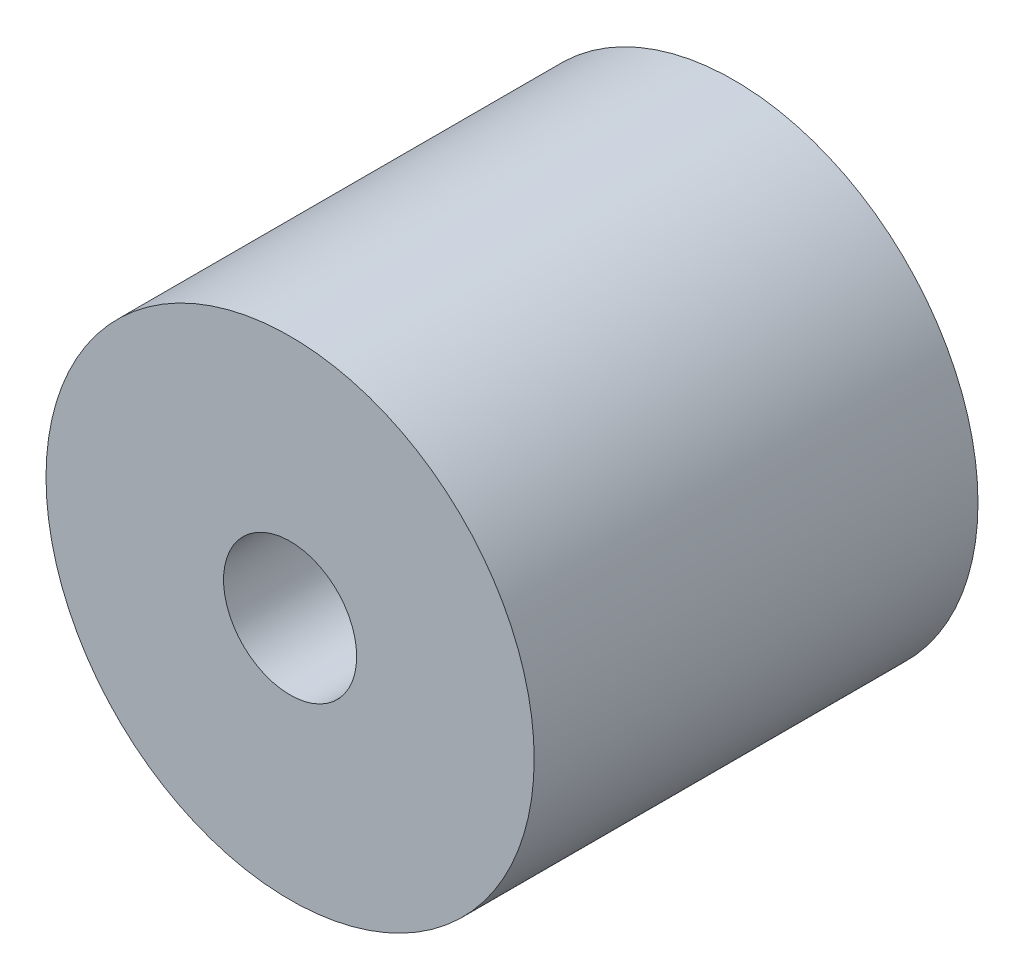
ISO-10303-21;
HEADER;
FILE_DESCRIPTION(('STEP AP214'),'2;1');
FILE_NAME('part.step','',(''),(''),'','','');
FILE_SCHEMA(('AUTOMOTIVE_DESIGN { 1 0 10303 214 1 1 1 1 }'));
ENDSEC;
DATA;
#1=APPLICATION_CONTEXT('core data for automotive mechanical design processes');
#2=APPLICATION_PROTOCOL_DEFINITION('international standard','automotive_design',2000,#1);
#3=PRODUCT_CONTEXT('',#1,'mechanical');
#4=PRODUCT('Part','Part','',(#3));
#5=PRODUCT_RELATED_PRODUCT_CATEGORY('part','',(#4));
#6=PRODUCT_DEFINITION_FORMATION('','',#4);
#7=PRODUCT_DEFINITION_CONTEXT('part definition',#1,'design');
#8=PRODUCT_DEFINITION('design','',#6,#7);
#9=PRODUCT_DEFINITION_SHAPE('','',#8);
#10=(LENGTH_UNIT() NAMED_UNIT(*) SI_UNIT(.MILLI.,.METRE.));
#11=(NAMED_UNIT(*) PLANE_ANGLE_UNIT() SI_UNIT($,.RADIAN.));
#12=(NAMED_UNIT(*) SI_UNIT($,.STERADIAN.) SOLID_ANGLE_UNIT());
#13=UNCERTAINTY_MEASURE_WITH_UNIT(LENGTH_MEASURE(1.E-05),#10,'distance_accuracy_value','');
#14=(GEOMETRIC_REPRESENTATION_CONTEXT(3) GLOBAL_UNCERTAINTY_ASSIGNED_CONTEXT((#13)) GLOBAL_UNIT_ASSIGNED_CONTEXT((#10,
#11,#12)) REPRESENTATION_CONTEXT('',''));
#15=CARTESIAN_POINT('',(0.,0.,0.));
#16=DIRECTION('',(0.,0.,1.));
#17=DIRECTION('',(1.,0.,0.));
#18=AXIS2_PLACEMENT_3D('',#15,#16,#17);
#19=CARTESIAN_POINT('',(0.,0.,10.));
#20=DIRECTION('',(0.,0.,1.));
#21=DIRECTION('',(1.,0.,0.));
#22=AXIS2_PLACEMENT_3D('',#19,#20,#21);
#23=PLANE('',#22);
#24=CARTESIAN_POINT('',(0.,0.,10.));
#25=DIRECTION('',(0.,0.,1.));
#26=DIRECTION('',(1.,0.,0.));
#27=AXIS2_PLACEMENT_3D('',#24,#25,#26);
#28=CIRCLE('',#27,5.5);
#29=CARTESIAN_POINT('',(5.5,0.,10.));
#30=VERTEX_POINT('',#29);
#31=EDGE_CURVE('E10',#30,#30,#28,.T.);
#32=ORIENTED_EDGE('',*,*,#31,.T.);
#33=EDGE_LOOP('',(#32));
#34=FACE_BOUND('',#33,.T.);
#35=CARTESIAN_POINT('',(0.,0.,10.));
#36=DIRECTION('',(0.,0.,1.));
#37=DIRECTION('',(1.,0.,0.));
#38=AXIS2_PLACEMENT_3D('',#35,#36,#37);
#39=CIRCLE('',#38,1.5);
#40=CARTESIAN_POINT('',(1.5,0.,10.));
#41=VERTEX_POINT('',#40);
#42=EDGE_CURVE('E40',#41,#41,#39,.T.);
#43=ORIENTED_EDGE('',*,*,#42,.F.);
#44=EDGE_LOOP('',(#43));
#45=FACE_BOUND('',#44,.T.);
#46=ADVANCED_FACE('F29',(#34,#45),#23,.T.);
#47=CARTESIAN_POINT('',(0.,0.,0.));
#48=DIRECTION('',(0.,0.,1.));
#49=DIRECTION('',(1.,0.,0.));
#50=AXIS2_PLACEMENT_3D('',#47,#48,#49);
#51=PLANE('',#50);
#52=CARTESIAN_POINT('',(0.,0.,0.));
#53=DIRECTION('',(0.,0.,1.));
#54=DIRECTION('',(1.,0.,0.));
#55=AXIS2_PLACEMENT_3D('',#52,#53,#54);
#56=CIRCLE('',#55,5.5);
#57=CARTESIAN_POINT('',(5.5,0.,0.));
#58=VERTEX_POINT('',#57);
#59=EDGE_CURVE('E33',#58,#58,#56,.T.);
#60=ORIENTED_EDGE('',*,*,#59,.F.);
#61=EDGE_LOOP('',(#60));
#62=FACE_BOUND('',#61,.T.);
#63=CARTESIAN_POINT('',(0.,0.,0.));
#64=DIRECTION('',(0.,0.,1.));
#65=DIRECTION('',(1.,0.,0.));
#66=AXIS2_PLACEMENT_3D('',#63,#64,#65);
#67=CIRCLE('',#66,1.5);
#68=CARTESIAN_POINT('',(1.5,0.,0.));
#69=VERTEX_POINT('',#68);
#70=EDGE_CURVE('E42',#69,#69,#67,.T.);
#71=ORIENTED_EDGE('',*,*,#70,.T.);
#72=EDGE_LOOP('',(#71));
#73=FACE_BOUND('',#72,.T.);
#74=ADVANCED_FACE('F52',(#62,#73),#51,.F.);
#75=CARTESIAN_POINT('',(0.,0.,10.));
#76=DIRECTION('',(0.,0.,-1.));
#77=DIRECTION('',(-1.,0.,0.));
#78=AXIS2_PLACEMENT_3D('',#75,#76,#77);
#79=CYLINDRICAL_SURFACE('',#78,5.5);
#80=ORIENTED_EDGE('',*,*,#31,.F.);
#81=EDGE_LOOP('',(#80));
#82=FACE_BOUND('',#81,.T.);
#83=ORIENTED_EDGE('',*,*,#59,.T.);
#84=EDGE_LOOP('',(#83));
#85=FACE_BOUND('',#84,.T.);
#86=ADVANCED_FACE('F31',(#82,#85),#79,.T.);
#87=CARTESIAN_POINT('',(0.,0.,10.));
#88=DIRECTION('',(0.,0.,-1.));
#89=DIRECTION('',(-1.,0.,0.));
#90=AXIS2_PLACEMENT_3D('',#87,#88,#89);
#91=CYLINDRICAL_SURFACE('',#90,1.5);
#92=ORIENTED_EDGE('',*,*,#42,.T.);
#93=EDGE_LOOP('',(#92));
#94=FACE_BOUND('',#93,.T.);
#95=ORIENTED_EDGE('',*,*,#70,.F.);
#96=EDGE_LOOP('',(#95));
#97=FACE_BOUND('',#96,.T.);
#98=ADVANCED_FACE('F48',(#94,#97),#91,.F.);
#99=CLOSED_SHELL('',(#46,#74,#86,#98));
#100=MANIFOLD_SOLID_BREP('B2',#99);
#101=ADVANCED_BREP_SHAPE_REPRESENTATION('',(#18,#100),#14);
#102=SHAPE_DEFINITION_REPRESENTATION(#9,#101);
ENDSEC;
END-ISO-10303-21;
